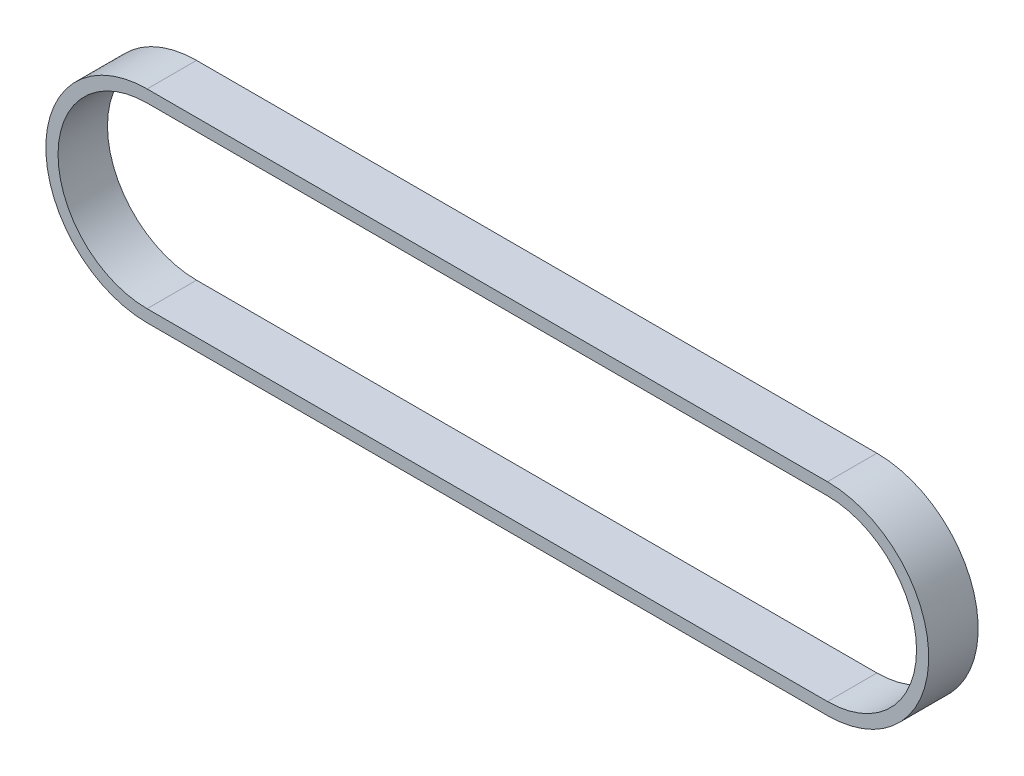
ISO-10303-21;
HEADER;
FILE_DESCRIPTION(('STEP AP214'),'2;1');
FILE_NAME('part.step','',(''),(''),'','','');
FILE_SCHEMA(('AUTOMOTIVE_DESIGN { 1 0 10303 214 1 1 1 1 }'));
ENDSEC;
DATA;
#1=APPLICATION_CONTEXT('core data for automotive mechanical design processes');
#2=APPLICATION_PROTOCOL_DEFINITION('international standard','automotive_design',2000,#1);
#3=PRODUCT_CONTEXT('',#1,'mechanical');
#4=PRODUCT('Part','Part','',(#3));
#5=PRODUCT_RELATED_PRODUCT_CATEGORY('part','',(#4));
#6=PRODUCT_DEFINITION_FORMATION('','',#4);
#7=PRODUCT_DEFINITION_CONTEXT('part definition',#1,'design');
#8=PRODUCT_DEFINITION('design','',#6,#7);
#9=PRODUCT_DEFINITION_SHAPE('','',#8);
#10=(LENGTH_UNIT() NAMED_UNIT(*) SI_UNIT(.MILLI.,.METRE.));
#11=(NAMED_UNIT(*) PLANE_ANGLE_UNIT() SI_UNIT($,.RADIAN.));
#12=(NAMED_UNIT(*) SI_UNIT($,.STERADIAN.) SOLID_ANGLE_UNIT());
#13=UNCERTAINTY_MEASURE_WITH_UNIT(LENGTH_MEASURE(1.E-05),#10,'distance_accuracy_value','');
#14=(GEOMETRIC_REPRESENTATION_CONTEXT(3) GLOBAL_UNCERTAINTY_ASSIGNED_CONTEXT((#13)) GLOBAL_UNIT_ASSIGNED_CONTEXT((#10,
#11,#12)) REPRESENTATION_CONTEXT('',''));
#15=CARTESIAN_POINT('',(0.,0.,0.));
#16=DIRECTION('',(0.,0.,1.));
#17=DIRECTION('',(1.,0.,0.));
#18=AXIS2_PLACEMENT_3D('',#15,#16,#17);
#19=CARTESIAN_POINT('',(0.,0.,9.52));
#20=DIRECTION('',(0.,0.,1.));
#21=DIRECTION('',(1.,0.,0.));
#22=AXIS2_PLACEMENT_3D('',#19,#20,#21);
#23=PLANE('',#22);
#24=CARTESIAN_POINT('',(0.,0.,9.52));
#25=DIRECTION('',(0.,0.,1.));
#26=DIRECTION('',(1.,0.,0.));
#27=AXIS2_PLACEMENT_3D('',#24,#25,#26);
#28=CIRCLE('',#27,19.5);
#29=CARTESIAN_POINT('',(0.,19.5,9.52));
#30=VERTEX_POINT('',#29);
#31=CARTESIAN_POINT('',(0.,-19.5,9.52));
#32=VERTEX_POINT('',#31);
#33=EDGE_CURVE('E157',#30,#32,#28,.T.);
#34=ORIENTED_EDGE('',*,*,#33,.T.);
#35=DIRECTION('',(1.,0.,0.));
#36=VECTOR('',#35,1.);
#37=CARTESIAN_POINT('',(0.,-19.5,9.52));
#38=LINE('',#37,#36);
#39=CARTESIAN_POINT('',(131.,-19.5,9.52));
#40=VERTEX_POINT('',#39);
#41=EDGE_CURVE('E161',#32,#40,#38,.T.);
#42=ORIENTED_EDGE('',*,*,#41,.T.);
#43=CARTESIAN_POINT('',(131.,0.,9.52));
#44=DIRECTION('',(0.,0.,1.));
#45=DIRECTION('',(1.,0.,0.));
#46=AXIS2_PLACEMENT_3D('',#43,#44,#45);
#47=CIRCLE('',#46,19.5);
#48=CARTESIAN_POINT('',(131.,19.5,9.52));
#49=VERTEX_POINT('',#48);
#50=EDGE_CURVE('E165',#40,#49,#47,.T.);
#51=ORIENTED_EDGE('',*,*,#50,.T.);
#52=DIRECTION('',(-1.,0.,0.));
#53=VECTOR('',#52,1.);
#54=CARTESIAN_POINT('',(0.,19.5,9.52));
#55=LINE('',#54,#53);
#56=EDGE_CURVE('E168',#49,#30,#55,.T.);
#57=ORIENTED_EDGE('',*,*,#56,.T.);
#58=EDGE_LOOP('',(#34,#42,#51,#57));
#59=FACE_BOUND('',#58,.T.);
#60=DIRECTION('',(1.,0.,0.));
#61=VECTOR('',#60,1.);
#62=CARTESIAN_POINT('',(0.,-17.15,9.52));
#63=LINE('',#62,#61);
#64=CARTESIAN_POINT('',(0.,-17.15,9.52));
#65=VERTEX_POINT('',#64);
#66=CARTESIAN_POINT('',(131.,-17.15,9.52));
#67=VERTEX_POINT('',#66);
#68=EDGE_CURVE('E118',#65,#67,#63,.T.);
#69=ORIENTED_EDGE('',*,*,#68,.F.);
#70=CARTESIAN_POINT('',(0.,0.,9.52));
#71=DIRECTION('',(0.,0.,1.));
#72=DIRECTION('',(1.,0.,0.));
#73=AXIS2_PLACEMENT_3D('',#70,#71,#72);
#74=CIRCLE('',#73,17.15);
#75=CARTESIAN_POINT('',(0.,17.15,9.52));
#76=VERTEX_POINT('',#75);
#77=EDGE_CURVE('E109',#76,#65,#74,.T.);
#78=ORIENTED_EDGE('',*,*,#77,.F.);
#79=DIRECTION('',(-1.,0.,0.));
#80=VECTOR('',#79,1.);
#81=CARTESIAN_POINT('',(0.,17.15,9.52));
#82=LINE('',#81,#80);
#83=CARTESIAN_POINT('',(131.,17.15,9.52));
#84=VERTEX_POINT('',#83);
#85=EDGE_CURVE('E135',#84,#76,#82,.T.);
#86=ORIENTED_EDGE('',*,*,#85,.F.);
#87=CARTESIAN_POINT('',(131.,0.,9.52));
#88=DIRECTION('',(0.,0.,1.));
#89=DIRECTION('',(1.,0.,0.));
#90=AXIS2_PLACEMENT_3D('',#87,#88,#89);
#91=CIRCLE('',#90,17.15);
#92=EDGE_CURVE('E131',#67,#84,#91,.T.);
#93=ORIENTED_EDGE('',*,*,#92,.F.);
#94=EDGE_LOOP('',(#69,#78,#86,#93));
#95=FACE_BOUND('',#94,.T.);
#96=ADVANCED_FACE('F43',(#59,#95),#23,.T.);
#97=CARTESIAN_POINT('',(0.,0.,0.));
#98=DIRECTION('',(0.,0.,1.));
#99=DIRECTION('',(1.,0.,0.));
#100=AXIS2_PLACEMENT_3D('',#97,#98,#99);
#101=PLANE('',#100);
#102=CARTESIAN_POINT('',(0.,0.,0.));
#103=DIRECTION('',(0.,0.,1.));
#104=DIRECTION('',(1.,0.,0.));
#105=AXIS2_PLACEMENT_3D('',#102,#103,#104);
#106=CIRCLE('',#105,19.5);
#107=CARTESIAN_POINT('',(0.,19.5,0.));
#108=VERTEX_POINT('',#107);
#109=CARTESIAN_POINT('',(0.,-19.5,0.));
#110=VERTEX_POINT('',#109);
#111=EDGE_CURVE('E127',#108,#110,#106,.T.);
#112=ORIENTED_EDGE('',*,*,#111,.F.);
#113=DIRECTION('',(-1.,0.,0.));
#114=VECTOR('',#113,1.);
#115=CARTESIAN_POINT('',(0.,19.5,0.));
#116=LINE('',#115,#114);
#117=CARTESIAN_POINT('',(131.,19.5,0.));
#118=VERTEX_POINT('',#117);
#119=EDGE_CURVE('E162',#118,#108,#116,.T.);
#120=ORIENTED_EDGE('',*,*,#119,.F.);
#121=CARTESIAN_POINT('',(131.,0.,0.));
#122=DIRECTION('',(0.,0.,1.));
#123=DIRECTION('',(1.,0.,0.));
#124=AXIS2_PLACEMENT_3D('',#121,#122,#123);
#125=CIRCLE('',#124,19.5);
#126=CARTESIAN_POINT('',(131.,-19.5,0.));
#127=VERTEX_POINT('',#126);
#128=EDGE_CURVE('E178',#127,#118,#125,.T.);
#129=ORIENTED_EDGE('',*,*,#128,.F.);
#130=DIRECTION('',(1.,0.,0.));
#131=VECTOR('',#130,1.);
#132=CARTESIAN_POINT('',(0.,-19.5,0.));
#133=LINE('',#132,#131);
#134=EDGE_CURVE('E175',#110,#127,#133,.T.);
#135=ORIENTED_EDGE('',*,*,#134,.F.);
#136=EDGE_LOOP('',(#112,#120,#129,#135));
#137=FACE_BOUND('',#136,.T.);
#138=CARTESIAN_POINT('',(0.,0.,0.));
#139=DIRECTION('',(0.,0.,1.));
#140=DIRECTION('',(1.,0.,0.));
#141=AXIS2_PLACEMENT_3D('',#138,#139,#140);
#142=CIRCLE('',#141,17.15);
#143=CARTESIAN_POINT('',(0.,17.15,0.));
#144=VERTEX_POINT('',#143);
#145=CARTESIAN_POINT('',(0.,-17.15,0.));
#146=VERTEX_POINT('',#145);
#147=EDGE_CURVE('E67',#144,#146,#142,.T.);
#148=ORIENTED_EDGE('',*,*,#147,.T.);
#149=DIRECTION('',(1.,0.,0.));
#150=VECTOR('',#149,1.);
#151=CARTESIAN_POINT('',(0.,-17.15,0.));
#152=LINE('',#151,#150);
#153=CARTESIAN_POINT('',(131.,-17.15,0.));
#154=VERTEX_POINT('',#153);
#155=EDGE_CURVE('E125',#146,#154,#152,.T.);
#156=ORIENTED_EDGE('',*,*,#155,.T.);
#157=CARTESIAN_POINT('',(131.,0.,0.));
#158=DIRECTION('',(0.,0.,1.));
#159=DIRECTION('',(1.,0.,0.));
#160=AXIS2_PLACEMENT_3D('',#157,#158,#159);
#161=CIRCLE('',#160,17.15);
#162=CARTESIAN_POINT('',(131.,17.15,0.));
#163=VERTEX_POINT('',#162);
#164=EDGE_CURVE('E144',#154,#163,#161,.T.);
#165=ORIENTED_EDGE('',*,*,#164,.T.);
#166=DIRECTION('',(-1.,0.,0.));
#167=VECTOR('',#166,1.);
#168=CARTESIAN_POINT('',(0.,17.15,0.));
#169=LINE('',#168,#167);
#170=EDGE_CURVE('E119',#163,#144,#169,.T.);
#171=ORIENTED_EDGE('',*,*,#170,.T.);
#172=EDGE_LOOP('',(#148,#156,#165,#171));
#173=FACE_BOUND('',#172,.T.);
#174=ADVANCED_FACE('F201',(#137,#173),#101,.F.);
#175=CARTESIAN_POINT('',(0.,0.,9.52));
#176=DIRECTION('',(0.,0.,-1.));
#177=DIRECTION('',(-1.,0.,0.));
#178=AXIS2_PLACEMENT_3D('',#175,#176,#177);
#179=CYLINDRICAL_SURFACE('',#178,19.5);
#180=ORIENTED_EDGE('',*,*,#111,.T.);
#181=DIRECTION('',(0.,0.,-1.));
#182=VECTOR('',#181,1.);
#183=CARTESIAN_POINT('',(0.,-19.5,9.52));
#184=LINE('',#183,#182);
#185=EDGE_CURVE('E11',#32,#110,#184,.T.);
#186=ORIENTED_EDGE('',*,*,#185,.F.);
#187=ORIENTED_EDGE('',*,*,#33,.F.);
#188=DIRECTION('',(0.,0.,-1.));
#189=VECTOR('',#188,1.);
#190=CARTESIAN_POINT('',(0.,19.5,9.52));
#191=LINE('',#190,#189);
#192=EDGE_CURVE('E171',#30,#108,#191,.T.);
#193=ORIENTED_EDGE('',*,*,#192,.T.);
#194=EDGE_LOOP('',(#180,#186,#187,#193));
#195=FACE_BOUND('',#194,.T.);
#196=ADVANCED_FACE('F45',(#195),#179,.T.);
#197=CARTESIAN_POINT('',(0.,-19.5,9.52));
#198=DIRECTION('',(0.,1.,0.));
#199=DIRECTION('',(0.,0.,1.));
#200=AXIS2_PLACEMENT_3D('',#197,#198,#199);
#201=PLANE('',#200);
#202=ORIENTED_EDGE('',*,*,#134,.T.);
#203=DIRECTION('',(0.,0.,-1.));
#204=VECTOR('',#203,1.);
#205=CARTESIAN_POINT('',(131.,-19.5,9.52));
#206=LINE('',#205,#204);
#207=EDGE_CURVE('E52',#40,#127,#206,.T.);
#208=ORIENTED_EDGE('',*,*,#207,.F.);
#209=ORIENTED_EDGE('',*,*,#41,.F.);
#210=ORIENTED_EDGE('',*,*,#185,.T.);
#211=EDGE_LOOP('',(#202,#208,#209,#210));
#212=FACE_BOUND('',#211,.T.);
#213=ADVANCED_FACE('F211',(#212),#201,.F.);
#214=CARTESIAN_POINT('',(131.,0.,9.52));
#215=DIRECTION('',(0.,0.,-1.));
#216=DIRECTION('',(-1.,0.,0.));
#217=AXIS2_PLACEMENT_3D('',#214,#215,#216);
#218=CYLINDRICAL_SURFACE('',#217,19.5);
#219=ORIENTED_EDGE('',*,*,#128,.T.);
#220=DIRECTION('',(0.,0.,-1.));
#221=VECTOR('',#220,1.);
#222=CARTESIAN_POINT('',(131.,19.5,9.52));
#223=LINE('',#222,#221);
#224=EDGE_CURVE('E186',#49,#118,#223,.T.);
#225=ORIENTED_EDGE('',*,*,#224,.F.);
#226=ORIENTED_EDGE('',*,*,#50,.F.);
#227=ORIENTED_EDGE('',*,*,#207,.T.);
#228=EDGE_LOOP('',(#219,#225,#226,#227));
#229=FACE_BOUND('',#228,.T.);
#230=ADVANCED_FACE('F195',(#229),#218,.T.);
#231=CARTESIAN_POINT('',(0.,19.5,9.52));
#232=DIRECTION('',(0.,-1.,0.));
#233=DIRECTION('',(0.,0.,-1.));
#234=AXIS2_PLACEMENT_3D('',#231,#232,#233);
#235=PLANE('',#234);
#236=ORIENTED_EDGE('',*,*,#119,.T.);
#237=ORIENTED_EDGE('',*,*,#192,.F.);
#238=ORIENTED_EDGE('',*,*,#56,.F.);
#239=ORIENTED_EDGE('',*,*,#224,.T.);
#240=EDGE_LOOP('',(#236,#237,#238,#239));
#241=FACE_BOUND('',#240,.T.);
#242=ADVANCED_FACE('F205',(#241),#235,.F.);
#243=CARTESIAN_POINT('',(0.,0.,9.52));
#244=DIRECTION('',(0.,0.,-1.));
#245=DIRECTION('',(-1.,0.,0.));
#246=AXIS2_PLACEMENT_3D('',#243,#244,#245);
#247=CYLINDRICAL_SURFACE('',#246,17.15);
#248=ORIENTED_EDGE('',*,*,#147,.F.);
#249=DIRECTION('',(0.,0.,-1.));
#250=VECTOR('',#249,1.);
#251=CARTESIAN_POINT('',(0.,17.15,9.52));
#252=LINE('',#251,#250);
#253=EDGE_CURVE('E113',#76,#144,#252,.T.);
#254=ORIENTED_EDGE('',*,*,#253,.F.);
#255=ORIENTED_EDGE('',*,*,#77,.T.);
#256=DIRECTION('',(0.,0.,-1.));
#257=VECTOR('',#256,1.);
#258=CARTESIAN_POINT('',(0.,-17.15,9.52));
#259=LINE('',#258,#257);
#260=EDGE_CURVE('E112',#65,#146,#259,.T.);
#261=ORIENTED_EDGE('',*,*,#260,.T.);
#262=EDGE_LOOP('',(#248,#254,#255,#261));
#263=FACE_BOUND('',#262,.T.);
#264=ADVANCED_FACE('F111',(#263),#247,.F.);
#265=CARTESIAN_POINT('',(0.,-17.15,9.52));
#266=DIRECTION('',(0.,1.,0.));
#267=DIRECTION('',(0.,0.,1.));
#268=AXIS2_PLACEMENT_3D('',#265,#266,#267);
#269=PLANE('',#268);
#270=ORIENTED_EDGE('',*,*,#155,.F.);
#271=ORIENTED_EDGE('',*,*,#260,.F.);
#272=ORIENTED_EDGE('',*,*,#68,.T.);
#273=DIRECTION('',(0.,0.,-1.));
#274=VECTOR('',#273,1.);
#275=CARTESIAN_POINT('',(131.,-17.15,9.52));
#276=LINE('',#275,#274);
#277=EDGE_CURVE('E128',#67,#154,#276,.T.);
#278=ORIENTED_EDGE('',*,*,#277,.T.);
#279=EDGE_LOOP('',(#270,#271,#272,#278));
#280=FACE_BOUND('',#279,.T.);
#281=ADVANCED_FACE('F122',(#280),#269,.T.);
#282=CARTESIAN_POINT('',(131.,0.,9.52));
#283=DIRECTION('',(0.,0.,-1.));
#284=DIRECTION('',(-1.,0.,0.));
#285=AXIS2_PLACEMENT_3D('',#282,#283,#284);
#286=CYLINDRICAL_SURFACE('',#285,17.15);
#287=ORIENTED_EDGE('',*,*,#164,.F.);
#288=ORIENTED_EDGE('',*,*,#277,.F.);
#289=ORIENTED_EDGE('',*,*,#92,.T.);
#290=DIRECTION('',(0.,0.,-1.));
#291=VECTOR('',#290,1.);
#292=CARTESIAN_POINT('',(131.,17.15,9.52));
#293=LINE('',#292,#291);
#294=EDGE_CURVE('E59',#84,#163,#293,.T.);
#295=ORIENTED_EDGE('',*,*,#294,.T.);
#296=EDGE_LOOP('',(#287,#288,#289,#295));
#297=FACE_BOUND('',#296,.T.);
#298=ADVANCED_FACE('F234',(#297),#286,.F.);
#299=CARTESIAN_POINT('',(0.,17.15,9.52));
#300=DIRECTION('',(0.,-1.,0.));
#301=DIRECTION('',(0.,0.,-1.));
#302=AXIS2_PLACEMENT_3D('',#299,#300,#301);
#303=PLANE('',#302);
#304=ORIENTED_EDGE('',*,*,#170,.F.);
#305=ORIENTED_EDGE('',*,*,#294,.F.);
#306=ORIENTED_EDGE('',*,*,#85,.T.);
#307=ORIENTED_EDGE('',*,*,#253,.T.);
#308=EDGE_LOOP('',(#304,#305,#306,#307));
#309=FACE_BOUND('',#308,.T.);
#310=ADVANCED_FACE('F238',(#309),#303,.T.);
#311=CLOSED_SHELL('',(#96,#174,#196,#213,#230,#242,#264,#281,#298,#310));
#312=MANIFOLD_SOLID_BREP('B2',#311);
#313=ADVANCED_BREP_SHAPE_REPRESENTATION('',(#18,#312),#14);
#314=SHAPE_DEFINITION_REPRESENTATION(#9,#313);
ENDSEC;
END-ISO-10303-21;
